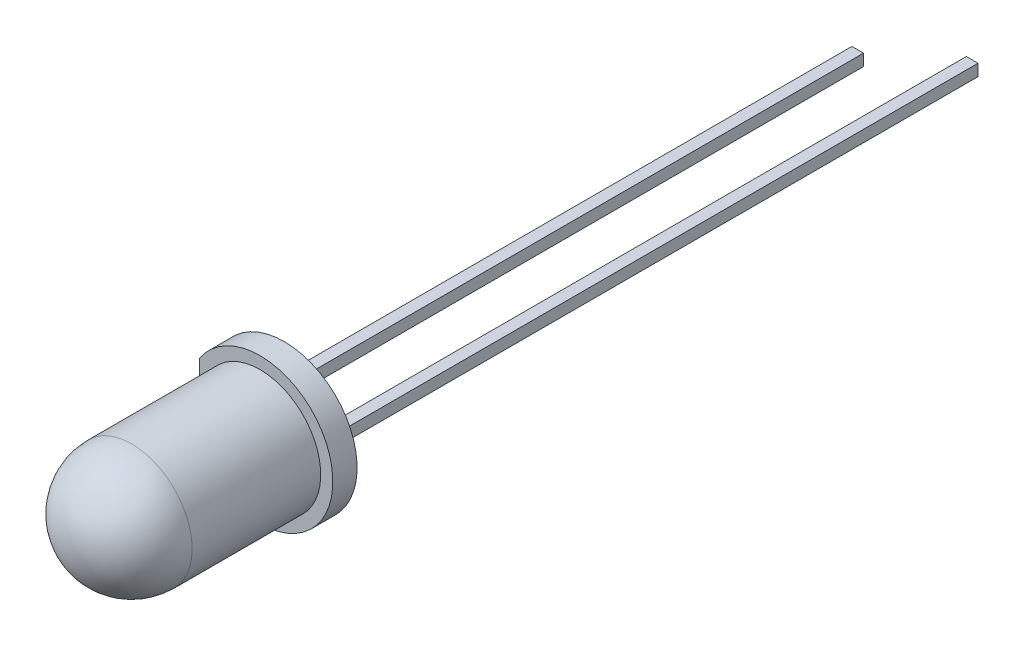
ISO-10303-21;
HEADER;
FILE_DESCRIPTION(('STEP AP214'),'2;1');
FILE_NAME('part.step','',(''),(''),'','','');
FILE_SCHEMA(('AUTOMOTIVE_DESIGN { 1 0 10303 214 1 1 1 1 }'));
ENDSEC;
DATA;
#1=APPLICATION_CONTEXT('core data for automotive mechanical design processes');
#2=APPLICATION_PROTOCOL_DEFINITION('international standard','automotive_design',2000,#1);
#3=PRODUCT_CONTEXT('',#1,'mechanical');
#4=PRODUCT('Part','Part','',(#3));
#5=PRODUCT_RELATED_PRODUCT_CATEGORY('part','',(#4));
#6=PRODUCT_DEFINITION_FORMATION('','',#4);
#7=PRODUCT_DEFINITION_CONTEXT('part definition',#1,'design');
#8=PRODUCT_DEFINITION('design','',#6,#7);
#9=PRODUCT_DEFINITION_SHAPE('','',#8);
#10=(LENGTH_UNIT() NAMED_UNIT(*) SI_UNIT(.MILLI.,.METRE.));
#11=(NAMED_UNIT(*) PLANE_ANGLE_UNIT() SI_UNIT($,.RADIAN.));
#12=(NAMED_UNIT(*) SI_UNIT($,.STERADIAN.) SOLID_ANGLE_UNIT());
#13=UNCERTAINTY_MEASURE_WITH_UNIT(LENGTH_MEASURE(1.E-05),#10,'distance_accuracy_value','');
#14=(GEOMETRIC_REPRESENTATION_CONTEXT(3) GLOBAL_UNCERTAINTY_ASSIGNED_CONTEXT((#13)) GLOBAL_UNIT_ASSIGNED_CONTEXT((#10,
#11,#12)) REPRESENTATION_CONTEXT('',''));
#15=CARTESIAN_POINT('',(0.,0.,0.));
#16=DIRECTION('',(0.,0.,1.));
#17=DIRECTION('',(1.,0.,0.));
#18=AXIS2_PLACEMENT_3D('',#15,#16,#17);
#19=CARTESIAN_POINT('',(-0.0499999999999997,0.,4.26666666666667));
#20=DIRECTION('',(0.,0.,1.));
#21=DIRECTION('',(-1.,0.,0.));
#22=AXIS2_PLACEMENT_3D('',#19,#20,#21);
#23=SPHERICAL_SURFACE('',#22,0.566666666666667);
#24=CARTESIAN_POINT('',(-0.0499999999999997,-0.24,4.26666666666667));
#25=DIRECTION('',(0.,1.,0.));
#26=DIRECTION('',(0.,0.,1.));
#27=AXIS2_PLACEMENT_3D('',#24,#25,#26);
#28=CIRCLE('',#27,0.513333333333333);
#29=CARTESIAN_POINT('',(-0.488634243989226,-0.24,4.));
#30=VERTEX_POINT('',#29);
#31=CARTESIAN_POINT('',(0.388634243989226,-0.24,4.));
#32=VERTEX_POINT('',#31);
#33=EDGE_CURVE('E184',#30,#32,#28,.F.);
#34=ORIENTED_EDGE('',*,*,#33,.T.);
#35=CARTESIAN_POINT('',(-0.0499999999999997,0.,4.));
#36=DIRECTION('',(0.,0.,1.));
#37=DIRECTION('',(1.,0.,0.));
#38=AXIS2_PLACEMENT_3D('',#35,#36,#37);
#39=CIRCLE('',#38,0.5);
#40=EDGE_CURVE('E63',#30,#32,#39,.T.);
#41=ORIENTED_EDGE('',*,*,#40,.F.);
#42=EDGE_LOOP('',(#34,#41));
#43=FACE_BOUND('',#42,.T.);
#44=ADVANCED_FACE('F54',(#43),#23,.T.);
#45=CARTESIAN_POINT('',(0.388634243989226,0.24,4.));
#46=VERTEX_POINT('',#45);
#47=CARTESIAN_POINT('',(-0.488634243989226,0.24,4.));
#48=VERTEX_POINT('',#47);
#49=EDGE_CURVE('E12',#46,#48,#39,.T.);
#50=ORIENTED_EDGE('',*,*,#49,.F.);
#51=CARTESIAN_POINT('',(-0.0499999999999997,0.24,4.26666666666667));
#52=DIRECTION('',(0.,1.,0.));
#53=DIRECTION('',(0.,0.,1.));
#54=AXIS2_PLACEMENT_3D('',#51,#52,#53);
#55=CIRCLE('',#54,0.513333333333333);
#56=EDGE_CURVE('E210',#48,#46,#55,.F.);
#57=ORIENTED_EDGE('',*,*,#56,.F.);
#58=EDGE_LOOP('',(#50,#57));
#59=FACE_BOUND('',#58,.T.);
#60=ADVANCED_FACE('F56',(#59),#23,.T.);
#61=CARTESIAN_POINT('',(-0.55,0.,4.));
#62=DIRECTION('',(0.,0.,-1.));
#63=DIRECTION('',(-1.,0.,0.));
#64=AXIS2_PLACEMENT_3D('',#61,#62,#63);
#65=PLANE('',#64);
#66=CARTESIAN_POINT('',(-0.0499999999999997,0.,4.));
#67=DIRECTION('',(0.,0.,1.));
#68=DIRECTION('',(1.,0.,0.));
#69=AXIS2_PLACEMENT_3D('',#66,#67,#68);
#70=CIRCLE('',#69,0.2);
#71=CARTESIAN_POINT('',(0.15,0.,4.));
#72=VERTEX_POINT('',#71);
#73=EDGE_CURVE('E308',#72,#72,#70,.T.);
#74=ORIENTED_EDGE('',*,*,#73,.F.);
#75=EDGE_LOOP('',(#74));
#76=FACE_BOUND('',#75,.T.);
#77=ORIENTED_EDGE('',*,*,#49,.T.);
#78=DIRECTION('',(1.,0.,0.));
#79=VECTOR('',#78,1.);
#80=CARTESIAN_POINT('',(-1.3,0.24,4.));
#81=LINE('',#80,#79);
#82=CARTESIAN_POINT('',(-1.3,0.24,4.));
#83=VERTEX_POINT('',#82);
#84=EDGE_CURVE('E109',#83,#48,#81,.T.);
#85=ORIENTED_EDGE('',*,*,#84,.F.);
#86=DIRECTION('',(0.,-1.,0.));
#87=VECTOR('',#86,1.);
#88=CARTESIAN_POINT('',(-1.3,0.24,4.));
#89=LINE('',#88,#87);
#90=CARTESIAN_POINT('',(-1.3,-0.24,4.));
#91=VERTEX_POINT('',#90);
#92=EDGE_CURVE('E182',#83,#91,#89,.T.);
#93=ORIENTED_EDGE('',*,*,#92,.T.);
#94=DIRECTION('',(1.,0.,0.));
#95=VECTOR('',#94,1.);
#96=CARTESIAN_POINT('',(-1.3,-0.24,4.));
#97=LINE('',#96,#95);
#98=EDGE_CURVE('E70',#91,#30,#97,.T.);
#99=ORIENTED_EDGE('',*,*,#98,.T.);
#100=ORIENTED_EDGE('',*,*,#40,.T.);
#101=CARTESIAN_POINT('',(1.2,-0.24,4.));
#102=VERTEX_POINT('',#101);
#103=EDGE_CURVE('E160',#32,#102,#97,.T.);
#104=ORIENTED_EDGE('',*,*,#103,.T.);
#105=DIRECTION('',(0.,-1.,0.));
#106=VECTOR('',#105,1.);
#107=CARTESIAN_POINT('',(1.2,0.24,4.));
#108=LINE('',#107,#106);
#109=CARTESIAN_POINT('',(1.2,0.24,4.));
#110=VERTEX_POINT('',#109);
#111=EDGE_CURVE('E139',#110,#102,#108,.T.);
#112=ORIENTED_EDGE('',*,*,#111,.F.);
#113=EDGE_CURVE('E125',#46,#110,#81,.T.);
#114=ORIENTED_EDGE('',*,*,#113,.F.);
#115=EDGE_LOOP('',(#77,#85,#93,#99,#100,#104,#112,#114));
#116=FACE_BOUND('',#115,.T.);
#117=ADVANCED_FACE('F193',(#76,#116),#65,.F.);
#118=CARTESIAN_POINT('',(0.,0.24,0.));
#119=DIRECTION('',(0.,1.,0.));
#120=DIRECTION('',(0.,0.,1.));
#121=AXIS2_PLACEMENT_3D('',#118,#119,#120);
#122=PLANE('',#121);
#123=ORIENTED_EDGE('',*,*,#84,.T.);
#124=ORIENTED_EDGE('',*,*,#56,.T.);
#125=ORIENTED_EDGE('',*,*,#113,.T.);
#126=DIRECTION('',(-0.508148861978286,0.,-0.861269257590315));
#127=VECTOR('',#126,1.);
#128=CARTESIAN_POINT('',(1.2,0.24,4.));
#129=LINE('',#128,#127);
#130=CARTESIAN_POINT('',(0.0199999999999998,0.24,2.));
#131=VERTEX_POINT('',#130);
#132=EDGE_CURVE('E116',#110,#131,#129,.T.);
#133=ORIENTED_EDGE('',*,*,#132,.T.);
#134=DIRECTION('',(-1.,0.,0.));
#135=VECTOR('',#134,1.);
#136=CARTESIAN_POINT('',(0.0199999999999998,0.24,2.));
#137=LINE('',#136,#135);
#138=CARTESIAN_POINT('',(-1.12,0.24,2.));
#139=VERTEX_POINT('',#138);
#140=EDGE_CURVE('E121',#131,#139,#137,.T.);
#141=ORIENTED_EDGE('',*,*,#140,.T.);
#142=DIRECTION('',(0.,0.,-1.));
#143=VECTOR('',#142,1.);
#144=CARTESIAN_POINT('',(-1.12,0.24,2.));
#145=LINE('',#144,#143);
#146=CARTESIAN_POINT('',(-1.12,0.24,-25.));
#147=VERTEX_POINT('',#146);
#148=EDGE_CURVE('E146',#139,#147,#145,.T.);
#149=ORIENTED_EDGE('',*,*,#148,.T.);
#150=DIRECTION('',(1.,0.,0.));
#151=VECTOR('',#150,1.);
#152=CARTESIAN_POINT('',(-1.12,0.24,-25.));
#153=LINE('',#152,#151);
#154=CARTESIAN_POINT('',(-1.6,0.24,-25.));
#155=VERTEX_POINT('',#154);
#156=EDGE_CURVE('E161',#155,#147,#153,.T.);
#157=ORIENTED_EDGE('',*,*,#156,.F.);
#158=DIRECTION('',(0.,0.,1.));
#159=VECTOR('',#158,1.);
#160=CARTESIAN_POINT('',(-1.6,0.24,0.));
#161=LINE('',#160,#159);
#162=CARTESIAN_POINT('',(-1.6,0.24,3.5));
#163=VERTEX_POINT('',#162);
#164=EDGE_CURVE('E79',#155,#163,#161,.T.);
#165=ORIENTED_EDGE('',*,*,#164,.T.);
#166=DIRECTION('',(0.514495755427526,0.,0.857492925712544));
#167=VECTOR('',#166,1.);
#168=CARTESIAN_POINT('',(-1.6,0.24,3.5));
#169=LINE('',#168,#167);
#170=EDGE_CURVE('E175',#163,#83,#169,.T.);
#171=ORIENTED_EDGE('',*,*,#170,.T.);
#172=EDGE_LOOP('',(#123,#124,#125,#133,#141,#149,#157,#165,#171));
#173=FACE_BOUND('',#172,.T.);
#174=ADVANCED_FACE('F118',(#173),#122,.T.);
#175=CARTESIAN_POINT('',(0.,-0.24,0.));
#176=DIRECTION('',(0.,1.,0.));
#177=DIRECTION('',(0.,0.,1.));
#178=AXIS2_PLACEMENT_3D('',#175,#176,#177);
#179=PLANE('',#178);
#180=ORIENTED_EDGE('',*,*,#33,.F.);
#181=ORIENTED_EDGE('',*,*,#98,.F.);
#182=DIRECTION('',(0.514495755427526,0.,0.857492925712544));
#183=VECTOR('',#182,1.);
#184=CARTESIAN_POINT('',(-1.6,-0.24,3.5));
#185=LINE('',#184,#183);
#186=CARTESIAN_POINT('',(-1.6,-0.24,3.5));
#187=VERTEX_POINT('',#186);
#188=EDGE_CURVE('E156',#187,#91,#185,.T.);
#189=ORIENTED_EDGE('',*,*,#188,.F.);
#190=DIRECTION('',(0.,0.,1.));
#191=VECTOR('',#190,1.);
#192=CARTESIAN_POINT('',(-1.6,-0.24,0.));
#193=LINE('',#192,#191);
#194=CARTESIAN_POINT('',(-1.6,-0.24,-25.));
#195=VERTEX_POINT('',#194);
#196=EDGE_CURVE('E103',#195,#187,#193,.T.);
#197=ORIENTED_EDGE('',*,*,#196,.F.);
#198=DIRECTION('',(-1.,0.,0.));
#199=VECTOR('',#198,1.);
#200=CARTESIAN_POINT('',(-1.12,-0.24,-25.));
#201=LINE('',#200,#199);
#202=CARTESIAN_POINT('',(-1.12,-0.24,-25.));
#203=VERTEX_POINT('',#202);
#204=EDGE_CURVE('E233',#203,#195,#201,.T.);
#205=ORIENTED_EDGE('',*,*,#204,.F.);
#206=DIRECTION('',(0.,0.,-1.));
#207=VECTOR('',#206,1.);
#208=CARTESIAN_POINT('',(-1.12,-0.24,2.));
#209=LINE('',#208,#207);
#210=CARTESIAN_POINT('',(-1.12,-0.24,2.));
#211=VERTEX_POINT('',#210);
#212=EDGE_CURVE('E169',#211,#203,#209,.T.);
#213=ORIENTED_EDGE('',*,*,#212,.F.);
#214=DIRECTION('',(-1.,0.,0.));
#215=VECTOR('',#214,1.);
#216=CARTESIAN_POINT('',(0.0199999999999998,-0.24,2.));
#217=LINE('',#216,#215);
#218=CARTESIAN_POINT('',(0.0199999999999998,-0.24,2.));
#219=VERTEX_POINT('',#218);
#220=EDGE_CURVE('E166',#219,#211,#217,.T.);
#221=ORIENTED_EDGE('',*,*,#220,.F.);
#222=DIRECTION('',(-0.508148861978286,0.,-0.861269257590315));
#223=VECTOR('',#222,1.);
#224=CARTESIAN_POINT('',(1.2,-0.24,4.));
#225=LINE('',#224,#223);
#226=EDGE_CURVE('E135',#102,#219,#225,.T.);
#227=ORIENTED_EDGE('',*,*,#226,.F.);
#228=ORIENTED_EDGE('',*,*,#103,.F.);
#229=EDGE_LOOP('',(#180,#181,#189,#197,#205,#213,#221,#227,#228));
#230=FACE_BOUND('',#229,.T.);
#231=ADVANCED_FACE('F269',(#230),#179,.F.);
#232=CARTESIAN_POINT('',(-1.6,0.24,3.5));
#233=DIRECTION('',(0.857492925712544,0.,-0.514495755427526));
#234=DIRECTION('',(-0.514495755427526,0.,-0.857492925712544));
#235=AXIS2_PLACEMENT_3D('',#232,#233,#234);
#236=PLANE('',#235);
#237=ORIENTED_EDGE('',*,*,#188,.T.);
#238=ORIENTED_EDGE('',*,*,#92,.F.);
#239=ORIENTED_EDGE('',*,*,#170,.F.);
#240=DIRECTION('',(0.,-1.,0.));
#241=VECTOR('',#240,1.);
#242=CARTESIAN_POINT('',(-1.6,0.24,3.5));
#243=LINE('',#242,#241);
#244=EDGE_CURVE('E155',#163,#187,#243,.T.);
#245=ORIENTED_EDGE('',*,*,#244,.T.);
#246=EDGE_LOOP('',(#237,#238,#239,#245));
#247=FACE_BOUND('',#246,.T.);
#248=ADVANCED_FACE('F266',(#247),#236,.F.);
#249=CARTESIAN_POINT('',(1.2,0.24,4.));
#250=DIRECTION('',(-0.861269257590315,0.,0.508148861978286));
#251=DIRECTION('',(0.508148861978286,0.,0.861269257590315));
#252=AXIS2_PLACEMENT_3D('',#249,#250,#251);
#253=PLANE('',#252);
#254=ORIENTED_EDGE('',*,*,#226,.T.);
#255=DIRECTION('',(0.,-1.,0.));
#256=VECTOR('',#255,1.);
#257=CARTESIAN_POINT('',(0.0199999999999998,0.24,2.));
#258=LINE('',#257,#256);
#259=EDGE_CURVE('E132',#131,#219,#258,.T.);
#260=ORIENTED_EDGE('',*,*,#259,.F.);
#261=ORIENTED_EDGE('',*,*,#132,.F.);
#262=ORIENTED_EDGE('',*,*,#111,.T.);
#263=EDGE_LOOP('',(#254,#260,#261,#262));
#264=FACE_BOUND('',#263,.T.);
#265=ADVANCED_FACE('F133',(#264),#253,.F.);
#266=CARTESIAN_POINT('',(0.0199999999999998,0.24,2.));
#267=DIRECTION('',(0.,0.,1.));
#268=DIRECTION('',(1.,0.,0.));
#269=AXIS2_PLACEMENT_3D('',#266,#267,#268);
#270=PLANE('',#269);
#271=ORIENTED_EDGE('',*,*,#220,.T.);
#272=DIRECTION('',(0.,-1.,0.));
#273=VECTOR('',#272,1.);
#274=CARTESIAN_POINT('',(-1.12,0.24,2.));
#275=LINE('',#274,#273);
#276=EDGE_CURVE('E140',#139,#211,#275,.T.);
#277=ORIENTED_EDGE('',*,*,#276,.F.);
#278=ORIENTED_EDGE('',*,*,#140,.F.);
#279=ORIENTED_EDGE('',*,*,#259,.T.);
#280=EDGE_LOOP('',(#271,#277,#278,#279));
#281=FACE_BOUND('',#280,.T.);
#282=ADVANCED_FACE('F142',(#281),#270,.F.);
#283=CARTESIAN_POINT('',(-1.12,0.24,2.));
#284=DIRECTION('',(-1.,0.,0.));
#285=DIRECTION('',(0.,0.,1.));
#286=AXIS2_PLACEMENT_3D('',#283,#284,#285);
#287=PLANE('',#286);
#288=ORIENTED_EDGE('',*,*,#212,.T.);
#289=DIRECTION('',(0.,-1.,0.));
#290=VECTOR('',#289,1.);
#291=CARTESIAN_POINT('',(-1.12,-0.24,-25.));
#292=LINE('',#291,#290);
#293=EDGE_CURVE('E225',#147,#203,#292,.T.);
#294=ORIENTED_EDGE('',*,*,#293,.F.);
#295=ORIENTED_EDGE('',*,*,#148,.F.);
#296=ORIENTED_EDGE('',*,*,#276,.T.);
#297=EDGE_LOOP('',(#288,#294,#295,#296));
#298=FACE_BOUND('',#297,.T.);
#299=ADVANCED_FACE('F229',(#298),#287,.F.);
#300=CARTESIAN_POINT('',(-1.6,0.24,0.));
#301=DIRECTION('',(1.,0.,0.));
#302=DIRECTION('',(0.,0.,-1.));
#303=AXIS2_PLACEMENT_3D('',#300,#301,#302);
#304=PLANE('',#303);
#305=ORIENTED_EDGE('',*,*,#196,.T.);
#306=ORIENTED_EDGE('',*,*,#244,.F.);
#307=ORIENTED_EDGE('',*,*,#164,.F.);
#308=DIRECTION('',(0.,1.,0.));
#309=VECTOR('',#308,1.);
#310=CARTESIAN_POINT('',(-1.6,-0.24,-25.));
#311=LINE('',#310,#309);
#312=EDGE_CURVE('E226',#195,#155,#311,.T.);
#313=ORIENTED_EDGE('',*,*,#312,.F.);
#314=EDGE_LOOP('',(#305,#306,#307,#313));
#315=FACE_BOUND('',#314,.T.);
#316=ADVANCED_FACE('F270',(#315),#304,.F.);
#317=CARTESIAN_POINT('',(0.,0.,-25.));
#318=DIRECTION('',(0.,0.,1.));
#319=DIRECTION('',(1.,0.,0.));
#320=AXIS2_PLACEMENT_3D('',#317,#318,#319);
#321=PLANE('',#320);
#322=ORIENTED_EDGE('',*,*,#293,.T.);
#323=ORIENTED_EDGE('',*,*,#204,.T.);
#324=ORIENTED_EDGE('',*,*,#312,.T.);
#325=ORIENTED_EDGE('',*,*,#156,.T.);
#326=EDGE_LOOP('',(#322,#323,#324,#325));
#327=FACE_BOUND('',#326,.T.);
#328=ADVANCED_FACE('F223',(#327),#321,.F.);
#329=CARTESIAN_POINT('',(-0.0499999999999997,0.,3.9));
#330=DIRECTION('',(0.,0.,1.));
#331=DIRECTION('',(1.,0.,0.));
#332=AXIS2_PLACEMENT_3D('',#329,#330,#331);
#333=CYLINDRICAL_SURFACE('',#332,0.2);
#334=CARTESIAN_POINT('',(-0.0499999999999997,0.,3.9));
#335=DIRECTION('',(0.,0.,1.));
#336=DIRECTION('',(1.,0.,0.));
#337=AXIS2_PLACEMENT_3D('',#334,#335,#336);
#338=CIRCLE('',#337,0.2);
#339=CARTESIAN_POINT('',(0.15,0.,3.9));
#340=VERTEX_POINT('',#339);
#341=EDGE_CURVE('E239',#340,#340,#338,.T.);
#342=ORIENTED_EDGE('',*,*,#341,.F.);
#343=EDGE_LOOP('',(#342));
#344=FACE_BOUND('',#343,.T.);
#345=ORIENTED_EDGE('',*,*,#73,.T.);
#346=EDGE_LOOP('',(#345));
#347=FACE_BOUND('',#346,.T.);
#348=ADVANCED_FACE('F277',(#344,#347),#333,.F.);
#349=CARTESIAN_POINT('',(-0.0499999999999997,0.,3.9));
#350=DIRECTION('',(0.,0.,1.));
#351=DIRECTION('',(1.,0.,0.));
#352=AXIS2_PLACEMENT_3D('',#349,#350,#351);
#353=PLANE('',#352);
#354=ORIENTED_EDGE('',*,*,#341,.T.);
#355=EDGE_LOOP('',(#354));
#356=FACE_BOUND('',#355,.T.);
#357=ADVANCED_FACE('F299',(#356),#353,.T.);
#358=CLOSED_SHELL('',(#44,#60,#117,#174,#231,#248,#265,#282,#299,#316,#328,#348,#357));
#359=MANIFOLD_SOLID_BREP('B2',#358);
#360=CARTESIAN_POINT('',(1.12,0.24,2.));
#361=DIRECTION('',(0.,0.,1.));
#362=DIRECTION('',(1.,0.,0.));
#363=AXIS2_PLACEMENT_3D('',#360,#361,#362);
#364=PLANE('',#363);
#365=DIRECTION('',(-1.,0.,0.));
#366=VECTOR('',#365,1.);
#367=CARTESIAN_POINT('',(1.12,-0.24,2.));
#368=LINE('',#367,#366);
#369=CARTESIAN_POINT('',(1.12,-0.24,2.));
#370=VERTEX_POINT('',#369);
#371=CARTESIAN_POINT('',(0.22,-0.24,2.));
#372=VERTEX_POINT('',#371);
#373=EDGE_CURVE('E564',#370,#372,#368,.T.);
#374=ORIENTED_EDGE('',*,*,#373,.T.);
#375=DIRECTION('',(0.,-1.,0.));
#376=VECTOR('',#375,1.);
#377=CARTESIAN_POINT('',(0.22,0.24,2.));
#378=LINE('',#377,#376);
#379=CARTESIAN_POINT('',(0.22,0.24,2.));
#380=VERTEX_POINT('',#379);
#381=EDGE_CURVE('E52',#380,#372,#378,.T.);
#382=ORIENTED_EDGE('',*,*,#381,.F.);
#383=DIRECTION('',(-1.,0.,0.));
#384=VECTOR('',#383,1.);
#385=CARTESIAN_POINT('',(1.12,0.24,2.));
#386=LINE('',#385,#384);
#387=CARTESIAN_POINT('',(1.12,0.24,2.));
#388=VERTEX_POINT('',#387);
#389=EDGE_CURVE('E565',#388,#380,#386,.T.);
#390=ORIENTED_EDGE('',*,*,#389,.F.);
#391=DIRECTION('',(0.,-1.,0.));
#392=VECTOR('',#391,1.);
#393=CARTESIAN_POINT('',(1.12,0.24,2.));
#394=LINE('',#393,#392);
#395=EDGE_CURVE('E574',#388,#370,#394,.T.);
#396=ORIENTED_EDGE('',*,*,#395,.T.);
#397=EDGE_LOOP('',(#374,#382,#390,#396));
#398=FACE_BOUND('',#397,.T.);
#399=ADVANCED_FACE('F471',(#398),#364,.F.);
#400=CARTESIAN_POINT('',(0.22,0.24,2.));
#401=DIRECTION('',(0.861269257590315,0.,-0.508148861978286));
#402=DIRECTION('',(-0.508148861978286,0.,-0.861269257590315));
#403=AXIS2_PLACEMENT_3D('',#400,#401,#402);
#404=PLANE('',#403);
#405=DIRECTION('',(0.508148861978286,0.,0.861269257590315));
#406=VECTOR('',#405,1.);
#407=CARTESIAN_POINT('',(0.22,-0.24,2.));
#408=LINE('',#407,#406);
#409=CARTESIAN_POINT('',(1.4,-0.24,4.));
#410=VERTEX_POINT('',#409);
#411=EDGE_CURVE('E578',#372,#410,#408,.T.);
#412=ORIENTED_EDGE('',*,*,#411,.T.);
#413=DIRECTION('',(0.,-1.,0.));
#414=VECTOR('',#413,1.);
#415=CARTESIAN_POINT('',(1.4,0.24,4.));
#416=LINE('',#415,#414);
#417=CARTESIAN_POINT('',(1.4,0.24,4.));
#418=VERTEX_POINT('',#417);
#419=EDGE_CURVE('E480',#418,#410,#416,.T.);
#420=ORIENTED_EDGE('',*,*,#419,.F.);
#421=DIRECTION('',(0.508148861978286,0.,0.861269257590315));
#422=VECTOR('',#421,1.);
#423=CARTESIAN_POINT('',(0.22,0.24,2.));
#424=LINE('',#423,#422);
#425=EDGE_CURVE('E521',#380,#418,#424,.T.);
#426=ORIENTED_EDGE('',*,*,#425,.F.);
#427=ORIENTED_EDGE('',*,*,#381,.T.);
#428=EDGE_LOOP('',(#412,#420,#426,#427));
#429=FACE_BOUND('',#428,.T.);
#430=ADVANCED_FACE('F601',(#429),#404,.F.);
#431=CARTESIAN_POINT('',(1.4,0.24,4.));
#432=DIRECTION('',(0.,0.,-1.));
#433=DIRECTION('',(-1.,0.,0.));
#434=AXIS2_PLACEMENT_3D('',#431,#432,#433);
#435=PLANE('',#434);
#436=DIRECTION('',(1.,0.,0.));
#437=VECTOR('',#436,1.);
#438=CARTESIAN_POINT('',(1.4,-0.24,4.));
#439=LINE('',#438,#437);
#440=CARTESIAN_POINT('',(1.6,-0.24,4.));
#441=VERTEX_POINT('',#440);
#442=EDGE_CURVE('E507',#410,#441,#439,.T.);
#443=ORIENTED_EDGE('',*,*,#442,.T.);
#444=DIRECTION('',(0.,-1.,0.));
#445=VECTOR('',#444,1.);
#446=CARTESIAN_POINT('',(1.6,0.24,4.));
#447=LINE('',#446,#445);
#448=CARTESIAN_POINT('',(1.6,0.24,4.));
#449=VERTEX_POINT('',#448);
#450=EDGE_CURVE('E589',#449,#441,#447,.T.);
#451=ORIENTED_EDGE('',*,*,#450,.F.);
#452=DIRECTION('',(1.,0.,0.));
#453=VECTOR('',#452,1.);
#454=CARTESIAN_POINT('',(1.4,0.24,4.));
#455=LINE('',#454,#453);
#456=EDGE_CURVE('E538',#418,#449,#455,.T.);
#457=ORIENTED_EDGE('',*,*,#456,.F.);
#458=ORIENTED_EDGE('',*,*,#419,.T.);
#459=EDGE_LOOP('',(#443,#451,#457,#458));
#460=FACE_BOUND('',#459,.T.);
#461=ADVANCED_FACE('F593',(#460),#435,.F.);
#462=CARTESIAN_POINT('',(1.6,0.24,4.));
#463=DIRECTION('',(-1.,0.,0.));
#464=DIRECTION('',(0.,0.,1.));
#465=AXIS2_PLACEMENT_3D('',#462,#463,#464);
#466=PLANE('',#465);
#467=DIRECTION('',(0.,0.,-1.));
#468=VECTOR('',#467,1.);
#469=CARTESIAN_POINT('',(1.6,-0.24,4.));
#470=LINE('',#469,#468);
#471=CARTESIAN_POINT('',(1.6,-0.24,-27.));
#472=VERTEX_POINT('',#471);
#473=EDGE_CURVE('E546',#441,#472,#470,.T.);
#474=ORIENTED_EDGE('',*,*,#473,.T.);
#475=DIRECTION('',(0.,-1.,0.));
#476=VECTOR('',#475,1.);
#477=CARTESIAN_POINT('',(1.6,0.24,-27.));
#478=LINE('',#477,#476);
#479=CARTESIAN_POINT('',(1.6,0.24,-27.));
#480=VERTEX_POINT('',#479);
#481=EDGE_CURVE('E543',#480,#472,#478,.T.);
#482=ORIENTED_EDGE('',*,*,#481,.F.);
#483=DIRECTION('',(0.,0.,-1.));
#484=VECTOR('',#483,1.);
#485=CARTESIAN_POINT('',(1.6,0.24,4.));
#486=LINE('',#485,#484);
#487=EDGE_CURVE('E532',#449,#480,#486,.T.);
#488=ORIENTED_EDGE('',*,*,#487,.F.);
#489=ORIENTED_EDGE('',*,*,#450,.T.);
#490=EDGE_LOOP('',(#474,#482,#488,#489));
#491=FACE_BOUND('',#490,.T.);
#492=ADVANCED_FACE('F544',(#491),#466,.F.);
#493=CARTESIAN_POINT('',(1.12,0.24,0.));
#494=DIRECTION('',(1.,0.,0.));
#495=DIRECTION('',(0.,0.,-1.));
#496=AXIS2_PLACEMENT_3D('',#493,#494,#495);
#497=PLANE('',#496);
#498=DIRECTION('',(0.,0.,1.));
#499=VECTOR('',#498,1.);
#500=CARTESIAN_POINT('',(1.12,-0.24,0.));
#501=LINE('',#500,#499);
#502=CARTESIAN_POINT('',(1.12,-0.24,-27.));
#503=VERTEX_POINT('',#502);
#504=EDGE_CURVE('E514',#503,#370,#501,.T.);
#505=ORIENTED_EDGE('',*,*,#504,.T.);
#506=ORIENTED_EDGE('',*,*,#395,.F.);
#507=DIRECTION('',(0.,0.,1.));
#508=VECTOR('',#507,1.);
#509=CARTESIAN_POINT('',(1.12,0.24,0.));
#510=LINE('',#509,#508);
#511=CARTESIAN_POINT('',(1.12,0.24,-27.));
#512=VERTEX_POINT('',#511);
#513=EDGE_CURVE('E488',#512,#388,#510,.T.);
#514=ORIENTED_EDGE('',*,*,#513,.F.);
#515=DIRECTION('',(0.,1.,0.));
#516=VECTOR('',#515,1.);
#517=CARTESIAN_POINT('',(1.12,-0.24,-27.));
#518=LINE('',#517,#516);
#519=EDGE_CURVE('E555',#503,#512,#518,.T.);
#520=ORIENTED_EDGE('',*,*,#519,.F.);
#521=EDGE_LOOP('',(#505,#506,#514,#520));
#522=FACE_BOUND('',#521,.T.);
#523=ADVANCED_FACE('F597',(#522),#497,.F.);
#524=CARTESIAN_POINT('',(0.,0.24,0.));
#525=DIRECTION('',(0.,-1.,0.));
#526=DIRECTION('',(0.,0.,-1.));
#527=AXIS2_PLACEMENT_3D('',#524,#525,#526);
#528=PLANE('',#527);
#529=ORIENTED_EDGE('',*,*,#389,.T.);
#530=ORIENTED_EDGE('',*,*,#425,.T.);
#531=ORIENTED_EDGE('',*,*,#456,.T.);
#532=ORIENTED_EDGE('',*,*,#487,.T.);
#533=DIRECTION('',(1.,0.,0.));
#534=VECTOR('',#533,1.);
#535=CARTESIAN_POINT('',(1.12,0.24,-27.));
#536=LINE('',#535,#534);
#537=EDGE_CURVE('E536',#512,#480,#536,.T.);
#538=ORIENTED_EDGE('',*,*,#537,.F.);
#539=ORIENTED_EDGE('',*,*,#513,.T.);
#540=EDGE_LOOP('',(#529,#530,#531,#532,#538,#539));
#541=FACE_BOUND('',#540,.T.);
#542=ADVANCED_FACE('F534',(#541),#528,.F.);
#543=CARTESIAN_POINT('',(0.,-0.24,0.));
#544=DIRECTION('',(0.,-1.,0.));
#545=DIRECTION('',(0.,0.,-1.));
#546=AXIS2_PLACEMENT_3D('',#543,#544,#545);
#547=PLANE('',#546);
#548=ORIENTED_EDGE('',*,*,#373,.F.);
#549=ORIENTED_EDGE('',*,*,#504,.F.);
#550=DIRECTION('',(-1.,0.,0.));
#551=VECTOR('',#550,1.);
#552=CARTESIAN_POINT('',(1.6,-0.24,-27.));
#553=LINE('',#552,#551);
#554=EDGE_CURVE('E551',#472,#503,#553,.T.);
#555=ORIENTED_EDGE('',*,*,#554,.F.);
#556=ORIENTED_EDGE('',*,*,#473,.F.);
#557=ORIENTED_EDGE('',*,*,#442,.F.);
#558=ORIENTED_EDGE('',*,*,#411,.F.);
#559=EDGE_LOOP('',(#548,#549,#555,#556,#557,#558));
#560=FACE_BOUND('',#559,.T.);
#561=ADVANCED_FACE('F596',(#560),#547,.T.);
#562=CARTESIAN_POINT('',(0.,0.,-27.));
#563=DIRECTION('',(0.,0.,-1.));
#564=DIRECTION('',(-1.,0.,0.));
#565=AXIS2_PLACEMENT_3D('',#562,#563,#564);
#566=PLANE('',#565);
#567=ORIENTED_EDGE('',*,*,#537,.T.);
#568=ORIENTED_EDGE('',*,*,#481,.T.);
#569=ORIENTED_EDGE('',*,*,#554,.T.);
#570=ORIENTED_EDGE('',*,*,#519,.T.);
#571=EDGE_LOOP('',(#567,#568,#569,#570));
#572=FACE_BOUND('',#571,.T.);
#573=ADVANCED_FACE('F554',(#572),#566,.T.);
#574=CLOSED_SHELL('',(#399,#430,#461,#492,#523,#542,#561,#573));
#575=MANIFOLD_SOLID_BREP('B6',#574);
#576=CARTESIAN_POINT('',(0.,0.,1.));
#577=DIRECTION('',(0.,0.,-1.));
#578=DIRECTION('',(-1.,0.,0.));
#579=AXIS2_PLACEMENT_3D('',#576,#577,#578);
#580=CYLINDRICAL_SURFACE('',#579,3.);
#581=CARTESIAN_POINT('',(0.,0.,1.));
#582=DIRECTION('',(0.,0.,1.));
#583=DIRECTION('',(1.,0.,0.));
#584=AXIS2_PLACEMENT_3D('',#581,#582,#583);
#585=CIRCLE('',#584,3.);
#586=CARTESIAN_POINT('',(-2.5,-1.6583123951777,1.));
#587=VERTEX_POINT('',#586);
#588=CARTESIAN_POINT('',(-2.5,1.6583123951777,1.));
#589=VERTEX_POINT('',#588);
#590=EDGE_CURVE('E748',#587,#589,#585,.T.);
#591=ORIENTED_EDGE('',*,*,#590,.F.);
#592=DIRECTION('',(0.,0.,-1.));
#593=VECTOR('',#592,1.);
#594=CARTESIAN_POINT('',(-2.5,-1.6583123951777,4.35410196624969));
#595=LINE('',#594,#593);
#596=CARTESIAN_POINT('',(-2.5,-1.6583123951777,0.));
#597=VERTEX_POINT('',#596);
#598=EDGE_CURVE('E964',#587,#597,#595,.T.);
#599=ORIENTED_EDGE('',*,*,#598,.T.);
#600=CARTESIAN_POINT('',(0.,0.,0.));
#601=DIRECTION('',(0.,0.,1.));
#602=DIRECTION('',(1.,0.,0.));
#603=AXIS2_PLACEMENT_3D('',#600,#601,#602);
#604=CIRCLE('',#603,3.);
#605=CARTESIAN_POINT('',(-2.5,1.6583123951777,0.));
#606=VERTEX_POINT('',#605);
#607=EDGE_CURVE('E975',#597,#606,#604,.T.);
#608=ORIENTED_EDGE('',*,*,#607,.T.);
#609=DIRECTION('',(0.,0.,-1.));
#610=VECTOR('',#609,1.);
#611=CARTESIAN_POINT('',(-2.5,1.6583123951777,4.35410196624969));
#612=LINE('',#611,#610);
#613=EDGE_CURVE('E968',#589,#606,#612,.T.);
#614=ORIENTED_EDGE('',*,*,#613,.F.);
#615=EDGE_LOOP('',(#591,#599,#608,#614));
#616=FACE_BOUND('',#615,.T.);
#617=ADVANCED_FACE('F740',(#616),#580,.T.);
#618=CARTESIAN_POINT('',(0.,0.,1.));
#619=DIRECTION('',(0.,0.,1.));
#620=DIRECTION('',(1.,0.,0.));
#621=AXIS2_PLACEMENT_3D('',#618,#619,#620);
#622=PLANE('',#621);
#623=DIRECTION('',(0.,-1.,0.));
#624=VECTOR('',#623,1.);
#625=CARTESIAN_POINT('',(-2.5,1.6583123951777,1.));
#626=LINE('',#625,#624);
#627=CARTESIAN_POINT('',(-2.5,0.,1.));
#628=VERTEX_POINT('',#627);
#629=EDGE_CURVE('E958',#628,#587,#626,.T.);
#630=ORIENTED_EDGE('',*,*,#629,.T.);
#631=ORIENTED_EDGE('',*,*,#590,.T.);
#632=EDGE_CURVE('E960',#589,#628,#626,.T.);
#633=ORIENTED_EDGE('',*,*,#632,.T.);
#634=CARTESIAN_POINT('',(0.,0.,1.));
#635=DIRECTION('',(0.,0.,1.));
#636=DIRECTION('',(1.,0.,0.));
#637=AXIS2_PLACEMENT_3D('',#634,#635,#636);
#638=CIRCLE('',#637,2.5);
#639=EDGE_CURVE('E469',#628,#628,#638,.T.);
#640=ORIENTED_EDGE('',*,*,#639,.F.);
#641=EDGE_LOOP('',(#630,#631,#633,#640));
#642=FACE_BOUND('',#641,.T.);
#643=ADVANCED_FACE('F992',(#642),#622,.T.);
#644=CARTESIAN_POINT('',(0.,0.,0.));
#645=DIRECTION('',(0.,0.,1.));
#646=DIRECTION('',(1.,0.,0.));
#647=AXIS2_PLACEMENT_3D('',#644,#645,#646);
#648=PLANE('',#647);
#649=DIRECTION('',(0.,1.,0.));
#650=VECTOR('',#649,1.);
#651=CARTESIAN_POINT('',(-1.6,-0.24,0.));
#652=LINE('',#651,#650);
#653=CARTESIAN_POINT('',(-1.6,-0.24,0.));
#654=VERTEX_POINT('',#653);
#655=CARTESIAN_POINT('',(-1.6,0.24,0.));
#656=VERTEX_POINT('',#655);
#657=EDGE_CURVE('E855',#654,#656,#652,.T.);
#658=ORIENTED_EDGE('',*,*,#657,.F.);
#659=DIRECTION('',(-1.,0.,0.));
#660=VECTOR('',#659,1.);
#661=CARTESIAN_POINT('',(-1.6,-0.24,0.));
#662=LINE('',#661,#660);
#663=CARTESIAN_POINT('',(-1.12,-0.24,0.));
#664=VERTEX_POINT('',#663);
#665=EDGE_CURVE('E863',#664,#654,#662,.T.);
#666=ORIENTED_EDGE('',*,*,#665,.F.);
#667=DIRECTION('',(0.,1.,0.));
#668=VECTOR('',#667,1.);
#669=CARTESIAN_POINT('',(-1.12,-0.24,0.));
#670=LINE('',#669,#668);
#671=CARTESIAN_POINT('',(-1.12,0.24,0.));
#672=VERTEX_POINT('',#671);
#673=EDGE_CURVE('E959',#664,#672,#670,.T.);
#674=ORIENTED_EDGE('',*,*,#673,.T.);
#675=DIRECTION('',(-1.,0.,0.));
#676=VECTOR('',#675,1.);
#677=CARTESIAN_POINT('',(-1.6,0.24,0.));
#678=LINE('',#677,#676);
#679=EDGE_CURVE('E878',#672,#656,#678,.T.);
#680=ORIENTED_EDGE('',*,*,#679,.T.);
#681=EDGE_LOOP('',(#658,#666,#674,#680));
#682=FACE_BOUND('',#681,.T.);
#683=DIRECTION('',(0.,1.,0.));
#684=VECTOR('',#683,1.);
#685=CARTESIAN_POINT('',(1.12,-0.24,0.));
#686=LINE('',#685,#684);
#687=CARTESIAN_POINT('',(1.12,-0.24,0.));
#688=VERTEX_POINT('',#687);
#689=CARTESIAN_POINT('',(1.12,0.24,0.));
#690=VERTEX_POINT('',#689);
#691=EDGE_CURVE('E915',#688,#690,#686,.T.);
#692=ORIENTED_EDGE('',*,*,#691,.F.);
#693=DIRECTION('',(-1.,0.,0.));
#694=VECTOR('',#693,1.);
#695=CARTESIAN_POINT('',(1.12,-0.24,0.));
#696=LINE('',#695,#694);
#697=CARTESIAN_POINT('',(1.6,-0.24,0.));
#698=VERTEX_POINT('',#697);
#699=EDGE_CURVE('E890',#698,#688,#696,.T.);
#700=ORIENTED_EDGE('',*,*,#699,.F.);
#701=DIRECTION('',(0.,1.,0.));
#702=VECTOR('',#701,1.);
#703=CARTESIAN_POINT('',(1.6,-0.24,0.));
#704=LINE('',#703,#702);
#705=CARTESIAN_POINT('',(1.6,0.24,0.));
#706=VERTEX_POINT('',#705);
#707=EDGE_CURVE('E937',#698,#706,#704,.T.);
#708=ORIENTED_EDGE('',*,*,#707,.T.);
#709=DIRECTION('',(-1.,0.,0.));
#710=VECTOR('',#709,1.);
#711=CARTESIAN_POINT('',(1.12,0.24,0.));
#712=LINE('',#711,#710);
#713=EDGE_CURVE('E916',#706,#690,#712,.T.);
#714=ORIENTED_EDGE('',*,*,#713,.T.);
#715=EDGE_LOOP('',(#692,#700,#708,#714));
#716=FACE_BOUND('',#715,.T.);
#717=ORIENTED_EDGE('',*,*,#607,.F.);
#718=DIRECTION('',(0.,-1.,0.));
#719=VECTOR('',#718,1.);
#720=CARTESIAN_POINT('',(-2.5,1.6583123951777,0.));
#721=LINE('',#720,#719);
#722=EDGE_CURVE('E955',#606,#597,#721,.T.);
#723=ORIENTED_EDGE('',*,*,#722,.F.);
#724=EDGE_LOOP('',(#717,#723));
#725=FACE_BOUND('',#724,.T.);
#726=ADVANCED_FACE('F876',(#682,#716,#725),#648,.F.);
#727=CARTESIAN_POINT('',(0.,0.,6.3));
#728=DIRECTION('',(0.,0.,-1.));
#729=DIRECTION('',(0.,1.,0.));
#730=AXIS2_PLACEMENT_3D('',#727,#728,#729);
#731=SPHERICAL_SURFACE('',#730,2.5);
#732=CARTESIAN_POINT('',(0.,0.,6.3));
#733=DIRECTION('',(0.,0.,-1.));
#734=DIRECTION('',(0.,1.,0.));
#735=AXIS2_PLACEMENT_3D('',#732,#733,#734);
#736=CIRCLE('',#735,2.5);
#737=CARTESIAN_POINT('',(0.,2.5,6.3));
#738=VERTEX_POINT('',#737);
#739=EDGE_CURVE('E971',#738,#738,#736,.T.);
#740=ORIENTED_EDGE('',*,*,#739,.F.);
#741=EDGE_LOOP('',(#740));
#742=FACE_BOUND('',#741,.T.);
#743=ADVANCED_FACE('F996',(#742),#731,.T.);
#744=CARTESIAN_POINT('',(0.,0.,1.));
#745=DIRECTION('',(0.,0.,-1.));
#746=DIRECTION('',(0.,1.,0.));
#747=AXIS2_PLACEMENT_3D('',#744,#745,#746);
#748=CYLINDRICAL_SURFACE('',#747,2.5);
#749=ORIENTED_EDGE('',*,*,#739,.T.);
#750=EDGE_LOOP('',(#749));
#751=FACE_BOUND('',#750,.T.);
#752=ORIENTED_EDGE('',*,*,#639,.T.);
#753=EDGE_LOOP('',(#752));
#754=FACE_BOUND('',#753,.T.);
#755=ADVANCED_FACE('F994',(#751,#754),#748,.T.);
#756=CARTESIAN_POINT('',(-2.5,1.6583123951777,4.35410196624969));
#757=DIRECTION('',(1.,0.,0.));
#758=DIRECTION('',(0.,0.,-1.));
#759=AXIS2_PLACEMENT_3D('',#756,#757,#758);
#760=PLANE('',#759);
#761=ORIENTED_EDGE('',*,*,#613,.T.);
#762=ORIENTED_EDGE('',*,*,#722,.T.);
#763=ORIENTED_EDGE('',*,*,#598,.F.);
#764=ORIENTED_EDGE('',*,*,#629,.F.);
#765=ORIENTED_EDGE('',*,*,#632,.F.);
#766=EDGE_LOOP('',(#761,#762,#763,#764,#765));
#767=FACE_BOUND('',#766,.T.);
#768=ADVANCED_FACE('F988',(#767),#760,.F.);
#769=CARTESIAN_POINT('',(1.6,-0.24,0.));
#770=DIRECTION('',(1.,0.,0.));
#771=DIRECTION('',(0.,0.,-1.));
#772=AXIS2_PLACEMENT_3D('',#769,#770,#771);
#773=PLANE('',#772);
#774=DIRECTION('',(0.,0.,-1.));
#775=VECTOR('',#774,1.);
#776=CARTESIAN_POINT('',(1.6,0.24,0.));
#777=LINE('',#776,#775);
#778=CARTESIAN_POINT('',(1.6,0.24,4.));
#779=VERTEX_POINT('',#778);
#780=EDGE_CURVE('E895',#779,#706,#777,.T.);
#781=ORIENTED_EDGE('',*,*,#780,.T.);
#782=ORIENTED_EDGE('',*,*,#707,.F.);
#783=DIRECTION('',(0.,0.,-1.));
#784=VECTOR('',#783,1.);
#785=CARTESIAN_POINT('',(1.6,-0.24,0.));
#786=LINE('',#785,#784);
#787=CARTESIAN_POINT('',(1.6,-0.24,4.));
#788=VERTEX_POINT('',#787);
#789=EDGE_CURVE('E911',#788,#698,#786,.T.);
#790=ORIENTED_EDGE('',*,*,#789,.F.);
#791=DIRECTION('',(0.,1.,0.));
#792=VECTOR('',#791,1.);
#793=CARTESIAN_POINT('',(1.6,-0.24,4.));
#794=LINE('',#793,#792);
#795=EDGE_CURVE('E941',#788,#779,#794,.T.);
#796=ORIENTED_EDGE('',*,*,#795,.T.);
#797=EDGE_LOOP('',(#781,#782,#790,#796));
#798=FACE_BOUND('',#797,.T.);
#799=ADVANCED_FACE('F1003',(#798),#773,.F.);
#800=CARTESIAN_POINT('',(1.6,-0.24,4.));
#801=DIRECTION('',(0.,0.,1.));
#802=DIRECTION('',(1.,0.,0.));
#803=AXIS2_PLACEMENT_3D('',#800,#801,#802);
#804=PLANE('',#803);
#805=DIRECTION('',(1.,0.,0.));
#806=VECTOR('',#805,1.);
#807=CARTESIAN_POINT('',(1.6,0.24,4.));
#808=LINE('',#807,#806);
#809=CARTESIAN_POINT('',(1.4,0.24,4.));
#810=VERTEX_POINT('',#809);
#811=EDGE_CURVE('E930',#810,#779,#808,.T.);
#812=ORIENTED_EDGE('',*,*,#811,.T.);
#813=ORIENTED_EDGE('',*,*,#795,.F.);
#814=DIRECTION('',(1.,0.,0.));
#815=VECTOR('',#814,1.);
#816=CARTESIAN_POINT('',(1.6,-0.24,4.));
#817=LINE('',#816,#815);
#818=CARTESIAN_POINT('',(1.4,-0.24,4.));
#819=VERTEX_POINT('',#818);
#820=EDGE_CURVE('E907',#819,#788,#817,.T.);
#821=ORIENTED_EDGE('',*,*,#820,.F.);
#822=DIRECTION('',(0.,1.,0.));
#823=VECTOR('',#822,1.);
#824=CARTESIAN_POINT('',(1.4,-0.24,4.));
#825=LINE('',#824,#823);
#826=EDGE_CURVE('E944',#819,#810,#825,.T.);
#827=ORIENTED_EDGE('',*,*,#826,.T.);
#828=EDGE_LOOP('',(#812,#813,#821,#827));
#829=FACE_BOUND('',#828,.T.);
#830=ADVANCED_FACE('F1042',(#829),#804,.F.);
#831=CARTESIAN_POINT('',(1.4,-0.24,4.));
#832=DIRECTION('',(-0.861269257590315,0.,0.508148861978286));
#833=DIRECTION('',(0.508148861978286,0.,0.861269257590315));
#834=AXIS2_PLACEMENT_3D('',#831,#832,#833);
#835=PLANE('',#834);
#836=DIRECTION('',(0.508148861978286,0.,0.861269257590315));
#837=VECTOR('',#836,1.);
#838=CARTESIAN_POINT('',(1.4,0.24,4.));
#839=LINE('',#838,#837);
#840=CARTESIAN_POINT('',(0.22,0.24,2.));
#841=VERTEX_POINT('',#840);
#842=EDGE_CURVE('E926',#841,#810,#839,.T.);
#843=ORIENTED_EDGE('',*,*,#842,.T.);
#844=ORIENTED_EDGE('',*,*,#826,.F.);
#845=DIRECTION('',(0.508148861978286,0.,0.861269257590315));
#846=VECTOR('',#845,1.);
#847=CARTESIAN_POINT('',(1.4,-0.24,4.));
#848=LINE('',#847,#846);
#849=CARTESIAN_POINT('',(0.22,-0.24,2.));
#850=VERTEX_POINT('',#849);
#851=EDGE_CURVE('E903',#850,#819,#848,.T.);
#852=ORIENTED_EDGE('',*,*,#851,.F.);
#853=DIRECTION('',(0.,1.,0.));
#854=VECTOR('',#853,1.);
#855=CARTESIAN_POINT('',(0.22,-0.24,2.));
#856=LINE('',#855,#854);
#857=EDGE_CURVE('E947',#850,#841,#856,.T.);
#858=ORIENTED_EDGE('',*,*,#857,.T.);
#859=EDGE_LOOP('',(#843,#844,#852,#858));
#860=FACE_BOUND('',#859,.T.);
#861=ADVANCED_FACE('F1052',(#860),#835,.F.);
#862=CARTESIAN_POINT('',(0.22,-0.24,2.));
#863=DIRECTION('',(0.,0.,-1.));
#864=DIRECTION('',(-1.,0.,0.));
#865=AXIS2_PLACEMENT_3D('',#862,#863,#864);
#866=PLANE('',#865);
#867=DIRECTION('',(-1.,0.,0.));
#868=VECTOR('',#867,1.);
#869=CARTESIAN_POINT('',(0.22,0.24,2.));
#870=LINE('',#869,#868);
#871=CARTESIAN_POINT('',(1.12,0.24,2.));
#872=VERTEX_POINT('',#871);
#873=EDGE_CURVE('E922',#872,#841,#870,.T.);
#874=ORIENTED_EDGE('',*,*,#873,.T.);
#875=ORIENTED_EDGE('',*,*,#857,.F.);
#876=DIRECTION('',(-1.,0.,0.));
#877=VECTOR('',#876,1.);
#878=CARTESIAN_POINT('',(0.22,-0.24,2.));
#879=LINE('',#878,#877);
#880=CARTESIAN_POINT('',(1.12,-0.24,2.));
#881=VERTEX_POINT('',#880);
#882=EDGE_CURVE('E899',#881,#850,#879,.T.);
#883=ORIENTED_EDGE('',*,*,#882,.F.);
#884=DIRECTION('',(0.,1.,0.));
#885=VECTOR('',#884,1.);
#886=CARTESIAN_POINT('',(1.12,-0.24,2.));
#887=LINE('',#886,#885);
#888=EDGE_CURVE('E950',#881,#872,#887,.T.);
#889=ORIENTED_EDGE('',*,*,#888,.T.);
#890=EDGE_LOOP('',(#874,#875,#883,#889));
#891=FACE_BOUND('',#890,.T.);
#892=ADVANCED_FACE('F1062',(#891),#866,.F.);
#893=CARTESIAN_POINT('',(1.12,-0.24,2.));
#894=DIRECTION('',(-1.,0.,0.));
#895=DIRECTION('',(0.,0.,1.));
#896=AXIS2_PLACEMENT_3D('',#893,#894,#895);
#897=PLANE('',#896);
#898=DIRECTION('',(0.,0.,1.));
#899=VECTOR('',#898,1.);
#900=CARTESIAN_POINT('',(1.12,0.24,2.));
#901=LINE('',#900,#899);
#902=EDGE_CURVE('E763',#690,#872,#901,.T.);
#903=ORIENTED_EDGE('',*,*,#902,.T.);
#904=ORIENTED_EDGE('',*,*,#888,.F.);
#905=DIRECTION('',(0.,0.,1.));
#906=VECTOR('',#905,1.);
#907=CARTESIAN_POINT('',(1.12,-0.24,2.));
#908=LINE('',#907,#906);
#909=EDGE_CURVE('E894',#688,#881,#908,.T.);
#910=ORIENTED_EDGE('',*,*,#909,.F.);
#911=ORIENTED_EDGE('',*,*,#691,.T.);
#912=EDGE_LOOP('',(#903,#904,#910,#911));
#913=FACE_BOUND('',#912,.T.);
#914=ADVANCED_FACE('F1072',(#913),#897,.F.);
#915=CARTESIAN_POINT('',(0.,-0.24,0.));
#916=DIRECTION('',(0.,-1.,0.));
#917=DIRECTION('',(0.,0.,-1.));
#918=AXIS2_PLACEMENT_3D('',#915,#916,#917);
#919=PLANE('',#918);
#920=ORIENTED_EDGE('',*,*,#699,.T.);
#921=ORIENTED_EDGE('',*,*,#909,.T.);
#922=ORIENTED_EDGE('',*,*,#882,.T.);
#923=ORIENTED_EDGE('',*,*,#851,.T.);
#924=ORIENTED_EDGE('',*,*,#820,.T.);
#925=ORIENTED_EDGE('',*,*,#789,.T.);
#926=EDGE_LOOP('',(#920,#921,#922,#923,#924,#925));
#927=FACE_BOUND('',#926,.T.);
#928=ADVANCED_FACE('F1082',(#927),#919,.F.);
#929=CARTESIAN_POINT('',(0.,0.24,0.));
#930=DIRECTION('',(0.,-1.,0.));
#931=DIRECTION('',(0.,0.,-1.));
#932=AXIS2_PLACEMENT_3D('',#929,#930,#931);
#933=PLANE('',#932);
#934=ORIENTED_EDGE('',*,*,#713,.F.);
#935=ORIENTED_EDGE('',*,*,#780,.F.);
#936=ORIENTED_EDGE('',*,*,#811,.F.);
#937=ORIENTED_EDGE('',*,*,#842,.F.);
#938=ORIENTED_EDGE('',*,*,#873,.F.);
#939=ORIENTED_EDGE('',*,*,#902,.F.);
#940=EDGE_LOOP('',(#934,#935,#936,#937,#938,#939));
#941=FACE_BOUND('',#940,.T.);
#942=ADVANCED_FACE('F1092',(#941),#933,.T.);
#943=CARTESIAN_POINT('',(-1.12,-0.24,0.));
#944=DIRECTION('',(1.,0.,0.));
#945=DIRECTION('',(0.,0.,-1.));
#946=AXIS2_PLACEMENT_3D('',#943,#944,#945);
#947=PLANE('',#946);
#948=DIRECTION('',(0.,0.,-1.));
#949=VECTOR('',#948,1.);
#950=CARTESIAN_POINT('',(-1.12,0.24,0.));
#951=LINE('',#950,#949);
#952=CARTESIAN_POINT('',(-1.12,0.24,2.));
#953=VERTEX_POINT('',#952);
#954=EDGE_CURVE('E874',#953,#672,#951,.T.);
#955=ORIENTED_EDGE('',*,*,#954,.T.);
#956=ORIENTED_EDGE('',*,*,#673,.F.);
#957=DIRECTION('',(0.,0.,-1.));
#958=VECTOR('',#957,1.);
#959=CARTESIAN_POINT('',(-1.12,-0.24,0.));
#960=LINE('',#959,#958);
#961=CARTESIAN_POINT('',(-1.12,-0.24,2.));
#962=VERTEX_POINT('',#961);
#963=EDGE_CURVE('E870',#962,#664,#960,.T.);
#964=ORIENTED_EDGE('',*,*,#963,.F.);
#965=DIRECTION('',(0.,1.,0.));
#966=VECTOR('',#965,1.);
#967=CARTESIAN_POINT('',(-1.12,-0.24,2.));
#968=LINE('',#967,#966);
#969=EDGE_CURVE('E1252',#962,#953,#968,.T.);
#970=ORIENTED_EDGE('',*,*,#969,.T.);
#971=EDGE_LOOP('',(#955,#956,#964,#970));
#972=FACE_BOUND('',#971,.T.);
#973=ADVANCED_FACE('F1102',(#972),#947,.F.);
#974=CARTESIAN_POINT('',(-1.12,-0.24,2.));
#975=DIRECTION('',(0.,0.,-1.));
#976=DIRECTION('',(-1.,0.,0.));
#977=AXIS2_PLACEMENT_3D('',#974,#975,#976);
#978=PLANE('',#977);
#979=DIRECTION('',(-1.,0.,0.));
#980=VECTOR('',#979,1.);
#981=CARTESIAN_POINT('',(-1.12,0.24,2.));
#982=LINE('',#981,#980);
#983=CARTESIAN_POINT('',(0.0199999999999998,0.24,2.));
#984=VERTEX_POINT('',#983);
#985=EDGE_CURVE('E1255',#984,#953,#982,.T.);
#986=ORIENTED_EDGE('',*,*,#985,.T.);
#987=ORIENTED_EDGE('',*,*,#969,.F.);
#988=DIRECTION('',(-1.,0.,0.));
#989=VECTOR('',#988,1.);
#990=CARTESIAN_POINT('',(-1.12,-0.24,2.));
#991=LINE('',#990,#989);
#992=CARTESIAN_POINT('',(0.0199999999999998,-0.24,2.));
#993=VERTEX_POINT('',#992);
#994=EDGE_CURVE('E886',#993,#962,#991,.T.);
#995=ORIENTED_EDGE('',*,*,#994,.F.);
#996=DIRECTION('',(0.,1.,0.));
#997=VECTOR('',#996,1.);
#998=CARTESIAN_POINT('',(0.0199999999999998,-0.24,2.));
#999=LINE('',#998,#997);
#1000=EDGE_CURVE('E1261',#993,#984,#999,.T.);
#1001=ORIENTED_EDGE('',*,*,#1000,.T.);
#1002=EDGE_LOOP('',(#986,#987,#995,#1001));
#1003=FACE_BOUND('',#1002,.T.);
#1004=ADVANCED_FACE('F1111',(#1003),#978,.F.);
#1005=CARTESIAN_POINT('',(0.0199999999999998,-0.24,2.));
#1006=DIRECTION('',(0.861269257590315,0.,-0.508148861978286));
#1007=DIRECTION('',(-0.508148861978286,0.,-0.861269257590315));
#1008=AXIS2_PLACEMENT_3D('',#1005,#1006,#1007);
#1009=PLANE('',#1008);
#1010=DIRECTION('',(-0.508148861978286,0.,-0.861269257590315));
#1011=VECTOR('',#1010,1.);
#1012=CARTESIAN_POINT('',(0.0199999999999998,0.24,2.));
#1013=LINE('',#1012,#1011);
#1014=CARTESIAN_POINT('',(1.2,0.24,4.));
#1015=VERTEX_POINT('',#1014);
#1016=EDGE_CURVE('E1281',#1015,#984,#1013,.T.);
#1017=ORIENTED_EDGE('',*,*,#1016,.T.);
#1018=ORIENTED_EDGE('',*,*,#1000,.F.);
#1019=DIRECTION('',(-0.508148861978286,0.,-0.861269257590315));
#1020=VECTOR('',#1019,1.);
#1021=CARTESIAN_POINT('',(0.0199999999999998,-0.24,2.));
#1022=LINE('',#1021,#1020);
#1023=CARTESIAN_POINT('',(1.2,-0.24,4.));
#1024=VERTEX_POINT('',#1023);
#1025=EDGE_CURVE('E1296',#1024,#993,#1022,.T.);
#1026=ORIENTED_EDGE('',*,*,#1025,.F.);
#1027=DIRECTION('',(0.,1.,0.));
#1028=VECTOR('',#1027,1.);
#1029=CARTESIAN_POINT('',(1.2,-0.24,4.));
#1030=LINE('',#1029,#1028);
#1031=EDGE_CURVE('E1267',#1024,#1015,#1030,.T.);
#1032=ORIENTED_EDGE('',*,*,#1031,.T.);
#1033=EDGE_LOOP('',(#1017,#1018,#1026,#1032));
#1034=FACE_BOUND('',#1033,.T.);
#1035=ADVANCED_FACE('F1121',(#1034),#1009,.F.);
#1036=CARTESIAN_POINT('',(1.2,-0.24,4.));
#1037=DIRECTION('',(0.,0.,1.));
#1038=DIRECTION('',(1.,0.,0.));
#1039=AXIS2_PLACEMENT_3D('',#1036,#1037,#1038);
#1040=PLANE('',#1039);
#1041=DIRECTION('',(1.,0.,0.));
#1042=VECTOR('',#1041,1.);
#1043=CARTESIAN_POINT('',(1.2,0.24,4.));
#1044=LINE('',#1043,#1042);
#1045=CARTESIAN_POINT('',(-1.3,0.24,4.));
#1046=VERTEX_POINT('',#1045);
#1047=EDGE_CURVE('E1274',#1046,#1015,#1044,.T.);
#1048=ORIENTED_EDGE('',*,*,#1047,.T.);
#1049=ORIENTED_EDGE('',*,*,#1031,.F.);
#1050=DIRECTION('',(1.,0.,0.));
#1051=VECTOR('',#1050,1.);
#1052=CARTESIAN_POINT('',(1.2,-0.24,4.));
#1053=LINE('',#1052,#1051);
#1054=CARTESIAN_POINT('',(-1.3,-0.24,4.));
#1055=VERTEX_POINT('',#1054);
#1056=EDGE_CURVE('E1276',#1055,#1024,#1053,.T.);
#1057=ORIENTED_EDGE('',*,*,#1056,.F.);
#1058=DIRECTION('',(0.,1.,0.));
#1059=VECTOR('',#1058,1.);
#1060=CARTESIAN_POINT('',(-1.3,-0.24,4.));
#1061=LINE('',#1060,#1059);
#1062=EDGE_CURVE('E884',#1055,#1046,#1061,.T.);
#1063=ORIENTED_EDGE('',*,*,#1062,.T.);
#1064=EDGE_LOOP('',(#1048,#1049,#1057,#1063));
#1065=FACE_BOUND('',#1064,.T.);
#1066=ADVANCED_FACE('F1131',(#1065),#1040,.F.);
#1067=CARTESIAN_POINT('',(-1.3,-0.24,4.));
#1068=DIRECTION('',(-0.857492925712544,0.,0.514495755427526));
#1069=DIRECTION('',(0.514495755427526,0.,0.857492925712544));
#1070=AXIS2_PLACEMENT_3D('',#1067,#1068,#1069);
#1071=PLANE('',#1070);
#1072=DIRECTION('',(0.514495755427526,0.,0.857492925712544));
#1073=VECTOR('',#1072,1.);
#1074=CARTESIAN_POINT('',(-1.3,0.24,4.));
#1075=LINE('',#1074,#1073);
#1076=CARTESIAN_POINT('',(-1.6,0.24,3.5));
#1077=VERTEX_POINT('',#1076);
#1078=EDGE_CURVE('E1279',#1077,#1046,#1075,.T.);
#1079=ORIENTED_EDGE('',*,*,#1078,.T.);
#1080=ORIENTED_EDGE('',*,*,#1062,.F.);
#1081=DIRECTION('',(0.514495755427526,0.,0.857492925712544));
#1082=VECTOR('',#1081,1.);
#1083=CARTESIAN_POINT('',(-1.3,-0.24,4.));
#1084=LINE('',#1083,#1082);
#1085=CARTESIAN_POINT('',(-1.6,-0.24,3.5));
#1086=VERTEX_POINT('',#1085);
#1087=EDGE_CURVE('E862',#1086,#1055,#1084,.T.);
#1088=ORIENTED_EDGE('',*,*,#1087,.F.);
#1089=DIRECTION('',(0.,1.,0.));
#1090=VECTOR('',#1089,1.);
#1091=CARTESIAN_POINT('',(-1.6,-0.24,3.5));
#1092=LINE('',#1091,#1090);
#1093=EDGE_CURVE('E857',#1086,#1077,#1092,.T.);
#1094=ORIENTED_EDGE('',*,*,#1093,.T.);
#1095=EDGE_LOOP('',(#1079,#1080,#1088,#1094));
#1096=FACE_BOUND('',#1095,.T.);
#1097=ADVANCED_FACE('F1141',(#1096),#1071,.F.);
#1098=CARTESIAN_POINT('',(-1.6,-0.24,0.));
#1099=DIRECTION('',(-1.,0.,0.));
#1100=DIRECTION('',(0.,0.,1.));
#1101=AXIS2_PLACEMENT_3D('',#1098,#1099,#1100);
#1102=PLANE('',#1101);
#1103=DIRECTION('',(0.,0.,1.));
#1104=VECTOR('',#1103,1.);
#1105=CARTESIAN_POINT('',(-1.6,0.24,0.));
#1106=LINE('',#1105,#1104);
#1107=EDGE_CURVE('E755',#656,#1077,#1106,.T.);
#1108=ORIENTED_EDGE('',*,*,#1107,.T.);
#1109=ORIENTED_EDGE('',*,*,#1093,.F.);
#1110=DIRECTION('',(0.,0.,1.));
#1111=VECTOR('',#1110,1.);
#1112=CARTESIAN_POINT('',(-1.6,-0.24,0.));
#1113=LINE('',#1112,#1111);
#1114=EDGE_CURVE('E851',#654,#1086,#1113,.T.);
#1115=ORIENTED_EDGE('',*,*,#1114,.F.);
#1116=ORIENTED_EDGE('',*,*,#657,.T.);
#1117=EDGE_LOOP('',(#1108,#1109,#1115,#1116));
#1118=FACE_BOUND('',#1117,.T.);
#1119=ADVANCED_FACE('F853',(#1118),#1102,.F.);
#1120=CARTESIAN_POINT('',(0.,-0.24,0.));
#1121=DIRECTION('',(0.,-1.,0.));
#1122=DIRECTION('',(0.,0.,-1.));
#1123=AXIS2_PLACEMENT_3D('',#1120,#1121,#1122);
#1124=PLANE('',#1123);
#1125=ORIENTED_EDGE('',*,*,#665,.T.);
#1126=ORIENTED_EDGE('',*,*,#1114,.T.);
#1127=ORIENTED_EDGE('',*,*,#1087,.T.);
#1128=ORIENTED_EDGE('',*,*,#1056,.T.);
#1129=ORIENTED_EDGE('',*,*,#1025,.T.);
#1130=ORIENTED_EDGE('',*,*,#994,.T.);
#1131=ORIENTED_EDGE('',*,*,#963,.T.);
#1132=EDGE_LOOP('',(#1125,#1126,#1127,#1128,#1129,#1130,#1131));
#1133=FACE_BOUND('',#1132,.T.);
#1134=ADVANCED_FACE('F867',(#1133),#1124,.F.);
#1135=CARTESIAN_POINT('',(0.,0.24,0.));
#1136=DIRECTION('',(0.,-1.,0.));
#1137=DIRECTION('',(0.,0.,-1.));
#1138=AXIS2_PLACEMENT_3D('',#1135,#1136,#1137);
#1139=PLANE('',#1138);
#1140=ORIENTED_EDGE('',*,*,#679,.F.);
#1141=ORIENTED_EDGE('',*,*,#954,.F.);
#1142=ORIENTED_EDGE('',*,*,#985,.F.);
#1143=ORIENTED_EDGE('',*,*,#1016,.F.);
#1144=ORIENTED_EDGE('',*,*,#1047,.F.);
#1145=ORIENTED_EDGE('',*,*,#1078,.F.);
#1146=ORIENTED_EDGE('',*,*,#1107,.F.);
#1147=EDGE_LOOP('',(#1140,#1141,#1142,#1143,#1144,#1145,#1146));
#1148=FACE_BOUND('',#1147,.T.);
#1149=ADVANCED_FACE('F1168',(#1148),#1139,.T.);
#1150=CLOSED_SHELL('',(#617,#643,#726,#743,#755,#768,#799,#830,#861,#892,#914,#928,#942,#973,
#1004,#1035,#1066,#1097,#1119,#1134,#1149));
#1151=MANIFOLD_SOLID_BREP('B46',#1150);
#1152=ADVANCED_BREP_SHAPE_REPRESENTATION('',(#18,#359,#575,#1151),#14);
#1153=SHAPE_DEFINITION_REPRESENTATION(#9,#1152);
ENDSEC;
END-ISO-10303-21;
